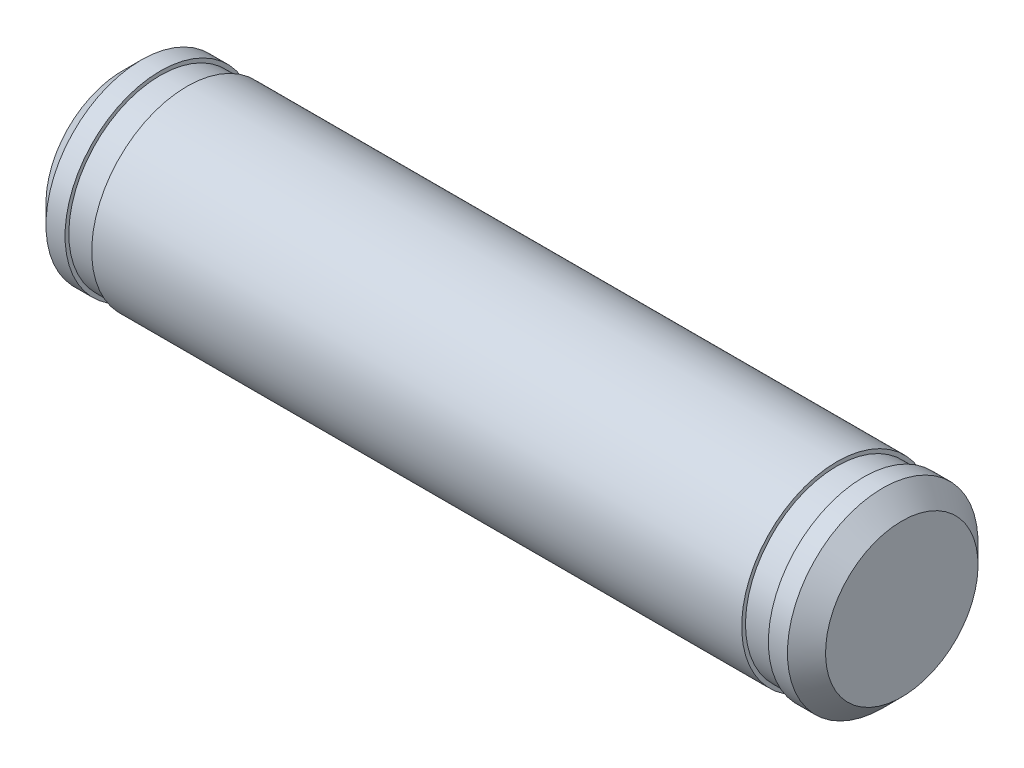
ISO-10303-21;
HEADER;
FILE_DESCRIPTION(('STEP AP214'),'2;1');
FILE_NAME('part.step','',(''),(''),'','','');
FILE_SCHEMA(('AUTOMOTIVE_DESIGN { 1 0 10303 214 1 1 1 1 }'));
ENDSEC;
DATA;
#1=APPLICATION_CONTEXT('core data for automotive mechanical design processes');
#2=APPLICATION_PROTOCOL_DEFINITION('international standard','automotive_design',2000,#1);
#3=PRODUCT_CONTEXT('',#1,'mechanical');
#4=PRODUCT('Part','Part','',(#3));
#5=PRODUCT_RELATED_PRODUCT_CATEGORY('part','',(#4));
#6=PRODUCT_DEFINITION_FORMATION('','',#4);
#7=PRODUCT_DEFINITION_CONTEXT('part definition',#1,'design');
#8=PRODUCT_DEFINITION('design','',#6,#7);
#9=PRODUCT_DEFINITION_SHAPE('','',#8);
#10=(LENGTH_UNIT() NAMED_UNIT(*) SI_UNIT(.MILLI.,.METRE.));
#11=(NAMED_UNIT(*) PLANE_ANGLE_UNIT() SI_UNIT($,.RADIAN.));
#12=(NAMED_UNIT(*) SI_UNIT($,.STERADIAN.) SOLID_ANGLE_UNIT());
#13=UNCERTAINTY_MEASURE_WITH_UNIT(LENGTH_MEASURE(1.E-05),#10,'distance_accuracy_value','');
#14=(GEOMETRIC_REPRESENTATION_CONTEXT(3) GLOBAL_UNCERTAINTY_ASSIGNED_CONTEXT((#13)) GLOBAL_UNIT_ASSIGNED_CONTEXT((#10,
#11,#12)) REPRESENTATION_CONTEXT('',''));
#15=CARTESIAN_POINT('',(0.,0.,0.));
#16=DIRECTION('',(0.,0.,1.));
#17=DIRECTION('',(1.,0.,0.));
#18=AXIS2_PLACEMENT_3D('',#15,#16,#17);
#19=CARTESIAN_POINT('',(-10.225,0.,0.));
#20=DIRECTION('',(-1.,0.,0.));
#21=DIRECTION('',(0.,-1.,0.));
#22=AXIS2_PLACEMENT_3D('',#19,#20,#21);
#23=PLANE('',#22);
#24=CARTESIAN_POINT('',(-10.225,0.,0.));
#25=DIRECTION('',(-1.,0.,0.));
#26=DIRECTION('',(0.,-1.,0.));
#27=AXIS2_PLACEMENT_3D('',#24,#25,#26);
#28=CIRCLE('',#27,1.99999999999999);
#29=CARTESIAN_POINT('',(-10.225,-1.99999999999999,0.));
#30=VERTEX_POINT('',#29);
#31=EDGE_CURVE('E10',#30,#30,#28,.T.);
#32=ORIENTED_EDGE('',*,*,#31,.T.);
#33=EDGE_LOOP('',(#32));
#34=FACE_BOUND('',#33,.T.);
#35=ADVANCED_FACE('F34',(#34),#23,.T.);
#36=CARTESIAN_POINT('',(10.225,0.,0.));
#37=DIRECTION('',(1.,0.,0.));
#38=DIRECTION('',(0.,1.,0.));
#39=AXIS2_PLACEMENT_3D('',#36,#37,#38);
#40=CYLINDRICAL_SURFACE('',#39,2.5);
#41=CARTESIAN_POINT('',(-9.72499999999999,0.,0.));
#42=DIRECTION('',(-1.,0.,0.));
#43=DIRECTION('',(0.,-1.,0.));
#44=AXIS2_PLACEMENT_3D('',#41,#42,#43);
#45=CIRCLE('',#44,2.5);
#46=CARTESIAN_POINT('',(-9.72499999999999,-2.5,0.));
#47=VERTEX_POINT('',#46);
#48=EDGE_CURVE('E42',#47,#47,#45,.F.);
#49=ORIENTED_EDGE('',*,*,#48,.T.);
#50=EDGE_LOOP('',(#49));
#51=FACE_BOUND('',#50,.T.);
#52=CARTESIAN_POINT('',(-9.225,0.,0.));
#53=DIRECTION('',(1.,0.,0.));
#54=DIRECTION('',(0.,1.,0.));
#55=AXIS2_PLACEMENT_3D('',#52,#53,#54);
#56=CIRCLE('',#55,2.5);
#57=CARTESIAN_POINT('',(-9.225,2.5,0.));
#58=VERTEX_POINT('',#57);
#59=EDGE_CURVE('E55',#58,#58,#56,.T.);
#60=ORIENTED_EDGE('',*,*,#59,.F.);
#61=EDGE_LOOP('',(#60));
#62=FACE_BOUND('',#61,.T.);
#63=ADVANCED_FACE('F98',(#51,#62),#40,.T.);
#64=CARTESIAN_POINT('',(-9.225,2.5,0.));
#65=DIRECTION('',(1.,0.,0.));
#66=DIRECTION('',(0.,1.,0.));
#67=AXIS2_PLACEMENT_3D('',#64,#65,#66);
#68=PLANE('',#67);
#69=ORIENTED_EDGE('',*,*,#59,.T.);
#70=EDGE_LOOP('',(#69));
#71=FACE_BOUND('',#70,.T.);
#72=CARTESIAN_POINT('',(-9.225,0.,0.));
#73=DIRECTION('',(1.,0.,0.));
#74=DIRECTION('',(0.,1.,0.));
#75=AXIS2_PLACEMENT_3D('',#72,#73,#74);
#76=CIRCLE('',#75,2.4);
#77=CARTESIAN_POINT('',(-9.225,2.4,0.));
#78=VERTEX_POINT('',#77);
#79=EDGE_CURVE('E58',#78,#78,#76,.T.);
#80=ORIENTED_EDGE('',*,*,#79,.F.);
#81=EDGE_LOOP('',(#80));
#82=FACE_BOUND('',#81,.T.);
#83=ADVANCED_FACE('F103',(#71,#82),#68,.T.);
#84=CARTESIAN_POINT('',(10.225,0.,0.));
#85=DIRECTION('',(1.,0.,0.));
#86=DIRECTION('',(0.,1.,0.));
#87=AXIS2_PLACEMENT_3D('',#84,#85,#86);
#88=CYLINDRICAL_SURFACE('',#87,2.4);
#89=ORIENTED_EDGE('',*,*,#79,.T.);
#90=EDGE_LOOP('',(#89));
#91=FACE_BOUND('',#90,.T.);
#92=CARTESIAN_POINT('',(-8.525,0.,0.));
#93=DIRECTION('',(1.,0.,0.));
#94=DIRECTION('',(0.,1.,0.));
#95=AXIS2_PLACEMENT_3D('',#92,#93,#94);
#96=CIRCLE('',#95,2.4);
#97=CARTESIAN_POINT('',(-8.525,2.4,0.));
#98=VERTEX_POINT('',#97);
#99=EDGE_CURVE('E61',#98,#98,#96,.T.);
#100=ORIENTED_EDGE('',*,*,#99,.F.);
#101=EDGE_LOOP('',(#100));
#102=FACE_BOUND('',#101,.T.);
#103=ADVANCED_FACE('F179',(#91,#102),#88,.T.);
#104=CARTESIAN_POINT('',(-8.525,2.4,0.));
#105=DIRECTION('',(-1.,0.,0.));
#106=DIRECTION('',(0.,-1.,0.));
#107=AXIS2_PLACEMENT_3D('',#104,#105,#106);
#108=PLANE('',#107);
#109=ORIENTED_EDGE('',*,*,#99,.T.);
#110=EDGE_LOOP('',(#109));
#111=FACE_BOUND('',#110,.T.);
#112=CARTESIAN_POINT('',(-8.525,0.,0.));
#113=DIRECTION('',(1.,0.,0.));
#114=DIRECTION('',(0.,1.,0.));
#115=AXIS2_PLACEMENT_3D('',#112,#113,#114);
#116=CIRCLE('',#115,2.5);
#117=CARTESIAN_POINT('',(-8.525,2.5,0.));
#118=VERTEX_POINT('',#117);
#119=EDGE_CURVE('E64',#118,#118,#116,.T.);
#120=ORIENTED_EDGE('',*,*,#119,.F.);
#121=EDGE_LOOP('',(#120));
#122=FACE_BOUND('',#121,.T.);
#123=ADVANCED_FACE('F169',(#111,#122),#108,.T.);
#124=CARTESIAN_POINT('',(10.225,0.,0.));
#125=DIRECTION('',(1.,0.,0.));
#126=DIRECTION('',(0.,1.,0.));
#127=AXIS2_PLACEMENT_3D('',#124,#125,#126);
#128=CYLINDRICAL_SURFACE('',#127,2.5);
#129=ORIENTED_EDGE('',*,*,#119,.T.);
#130=EDGE_LOOP('',(#129));
#131=FACE_BOUND('',#130,.T.);
#132=CARTESIAN_POINT('',(8.525,0.,0.));
#133=DIRECTION('',(1.,0.,0.));
#134=DIRECTION('',(0.,1.,0.));
#135=AXIS2_PLACEMENT_3D('',#132,#133,#134);
#136=CIRCLE('',#135,2.5);
#137=CARTESIAN_POINT('',(8.525,2.5,0.));
#138=VERTEX_POINT('',#137);
#139=EDGE_CURVE('E67',#138,#138,#136,.T.);
#140=ORIENTED_EDGE('',*,*,#139,.F.);
#141=EDGE_LOOP('',(#140));
#142=FACE_BOUND('',#141,.T.);
#143=ADVANCED_FACE('F159',(#131,#142),#128,.T.);
#144=CARTESIAN_POINT('',(8.525,2.4,0.));
#145=DIRECTION('',(1.,0.,0.));
#146=DIRECTION('',(0.,1.,0.));
#147=AXIS2_PLACEMENT_3D('',#144,#145,#146);
#148=PLANE('',#147);
#149=ORIENTED_EDGE('',*,*,#139,.T.);
#150=EDGE_LOOP('',(#149));
#151=FACE_BOUND('',#150,.T.);
#152=CARTESIAN_POINT('',(8.525,0.,0.));
#153=DIRECTION('',(1.,0.,0.));
#154=DIRECTION('',(0.,1.,0.));
#155=AXIS2_PLACEMENT_3D('',#152,#153,#154);
#156=CIRCLE('',#155,2.4);
#157=CARTESIAN_POINT('',(8.525,2.4,0.));
#158=VERTEX_POINT('',#157);
#159=EDGE_CURVE('E70',#158,#158,#156,.T.);
#160=ORIENTED_EDGE('',*,*,#159,.F.);
#161=EDGE_LOOP('',(#160));
#162=FACE_BOUND('',#161,.T.);
#163=ADVANCED_FACE('F94',(#151,#162),#148,.T.);
#164=CARTESIAN_POINT('',(10.225,0.,0.));
#165=DIRECTION('',(1.,0.,0.));
#166=DIRECTION('',(0.,1.,0.));
#167=AXIS2_PLACEMENT_3D('',#164,#165,#166);
#168=CYLINDRICAL_SURFACE('',#167,2.4);
#169=ORIENTED_EDGE('',*,*,#159,.T.);
#170=EDGE_LOOP('',(#169));
#171=FACE_BOUND('',#170,.T.);
#172=CARTESIAN_POINT('',(9.225,0.,0.));
#173=DIRECTION('',(1.,0.,0.));
#174=DIRECTION('',(0.,1.,0.));
#175=AXIS2_PLACEMENT_3D('',#172,#173,#174);
#176=CIRCLE('',#175,2.4);
#177=CARTESIAN_POINT('',(9.225,2.4,0.));
#178=VERTEX_POINT('',#177);
#179=EDGE_CURVE('E73',#178,#178,#176,.T.);
#180=ORIENTED_EDGE('',*,*,#179,.F.);
#181=EDGE_LOOP('',(#180));
#182=FACE_BOUND('',#181,.T.);
#183=ADVANCED_FACE('F84',(#171,#182),#168,.T.);
#184=CARTESIAN_POINT('',(9.225,2.5,0.));
#185=DIRECTION('',(-1.,0.,0.));
#186=DIRECTION('',(0.,-1.,0.));
#187=AXIS2_PLACEMENT_3D('',#184,#185,#186);
#188=PLANE('',#187);
#189=ORIENTED_EDGE('',*,*,#179,.T.);
#190=EDGE_LOOP('',(#189));
#191=FACE_BOUND('',#190,.T.);
#192=CARTESIAN_POINT('',(9.225,0.,0.));
#193=DIRECTION('',(1.,0.,0.));
#194=DIRECTION('',(0.,1.,0.));
#195=AXIS2_PLACEMENT_3D('',#192,#193,#194);
#196=CIRCLE('',#195,2.5);
#197=CARTESIAN_POINT('',(9.225,2.5,0.));
#198=VERTEX_POINT('',#197);
#199=EDGE_CURVE('E76',#198,#198,#196,.T.);
#200=ORIENTED_EDGE('',*,*,#199,.F.);
#201=EDGE_LOOP('',(#200));
#202=FACE_BOUND('',#201,.T.);
#203=ADVANCED_FACE('F82',(#191,#202),#188,.T.);
#204=CARTESIAN_POINT('',(10.225,0.,0.));
#205=DIRECTION('',(1.,0.,0.));
#206=DIRECTION('',(0.,1.,0.));
#207=AXIS2_PLACEMENT_3D('',#204,#205,#206);
#208=CYLINDRICAL_SURFACE('',#207,2.5);
#209=CARTESIAN_POINT('',(9.725,0.,0.));
#210=DIRECTION('',(1.,0.,0.));
#211=DIRECTION('',(0.,1.,0.));
#212=AXIS2_PLACEMENT_3D('',#209,#210,#211);
#213=CIRCLE('',#212,2.5);
#214=CARTESIAN_POINT('',(9.725,2.5,0.));
#215=VERTEX_POINT('',#214);
#216=EDGE_CURVE('E46',#215,#215,#213,.F.);
#217=ORIENTED_EDGE('',*,*,#216,.T.);
#218=EDGE_LOOP('',(#217));
#219=FACE_BOUND('',#218,.T.);
#220=ORIENTED_EDGE('',*,*,#199,.T.);
#221=EDGE_LOOP('',(#220));
#222=FACE_BOUND('',#221,.T.);
#223=ADVANCED_FACE('F80',(#219,#222),#208,.T.);
#224=CARTESIAN_POINT('',(10.225,0.,0.));
#225=DIRECTION('',(1.,0.,0.));
#226=DIRECTION('',(0.,1.,0.));
#227=AXIS2_PLACEMENT_3D('',#224,#225,#226);
#228=PLANE('',#227);
#229=CARTESIAN_POINT('',(10.225,0.,0.));
#230=DIRECTION('',(1.,0.,0.));
#231=DIRECTION('',(0.,1.,0.));
#232=AXIS2_PLACEMENT_3D('',#229,#230,#231);
#233=CIRCLE('',#232,2.);
#234=CARTESIAN_POINT('',(10.225,2.,0.));
#235=VERTEX_POINT('',#234);
#236=EDGE_CURVE('E50',#235,#235,#233,.T.);
#237=ORIENTED_EDGE('',*,*,#236,.T.);
#238=EDGE_LOOP('',(#237));
#239=FACE_BOUND('',#238,.T.);
#240=ADVANCED_FACE('F91',(#239),#228,.T.);
#241=CARTESIAN_POINT('',(10.225,0.,0.));
#242=DIRECTION('',(-1.,0.,0.));
#243=DIRECTION('',(0.,-1.,0.));
#244=AXIS2_PLACEMENT_3D('',#241,#242,#243);
#245=CONICAL_SURFACE('',#244,2.,0.785398163397446);
#246=ORIENTED_EDGE('',*,*,#216,.F.);
#247=EDGE_LOOP('',(#246));
#248=FACE_BOUND('',#247,.T.);
#249=ORIENTED_EDGE('',*,*,#236,.F.);
#250=EDGE_LOOP('',(#249));
#251=FACE_BOUND('',#250,.T.);
#252=ADVANCED_FACE('F107',(#248,#251),#245,.T.);
#253=CARTESIAN_POINT('',(-9.72499999999999,0.,0.));
#254=DIRECTION('',(1.,0.,0.));
#255=DIRECTION('',(0.,1.,0.));
#256=AXIS2_PLACEMENT_3D('',#253,#254,#255);
#257=CONICAL_SURFACE('',#256,2.5,0.78539816339745);
#258=ORIENTED_EDGE('',*,*,#31,.F.);
#259=EDGE_LOOP('',(#258));
#260=FACE_BOUND('',#259,.T.);
#261=ORIENTED_EDGE('',*,*,#48,.F.);
#262=EDGE_LOOP('',(#261));
#263=FACE_BOUND('',#262,.T.);
#264=ADVANCED_FACE('F37',(#260,#263),#257,.T.);
#265=CLOSED_SHELL('',(#35,#63,#83,#103,#123,#143,#163,#183,#203,#223,#240,#252,#264));
#266=MANIFOLD_SOLID_BREP('B2',#265);
#267=ADVANCED_BREP_SHAPE_REPRESENTATION('',(#18,#266),#14);
#268=SHAPE_DEFINITION_REPRESENTATION(#9,#267);
ENDSEC;
END-ISO-10303-21;
